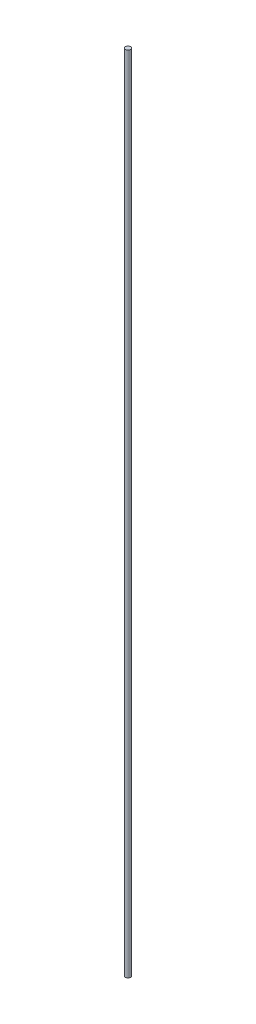
ISO-10303-21;
HEADER;
FILE_DESCRIPTION(('STEP AP214'),'2;1');
FILE_NAME('part.step','',(''),(''),'','','');
FILE_SCHEMA(('AUTOMOTIVE_DESIGN { 1 0 10303 214 1 1 1 1 }'));
ENDSEC;
DATA;
#1=APPLICATION_CONTEXT('core data for automotive mechanical design processes');
#2=APPLICATION_PROTOCOL_DEFINITION('international standard','automotive_design',2000,#1);
#3=PRODUCT_CONTEXT('',#1,'mechanical');
#4=PRODUCT('Part','Part','',(#3));
#5=PRODUCT_RELATED_PRODUCT_CATEGORY('part','',(#4));
#6=PRODUCT_DEFINITION_FORMATION('','',#4);
#7=PRODUCT_DEFINITION_CONTEXT('part definition',#1,'design');
#8=PRODUCT_DEFINITION('design','',#6,#7);
#9=PRODUCT_DEFINITION_SHAPE('','',#8);
#10=(LENGTH_UNIT() NAMED_UNIT(*) SI_UNIT(.MILLI.,.METRE.));
#11=(NAMED_UNIT(*) PLANE_ANGLE_UNIT() SI_UNIT($,.RADIAN.));
#12=(NAMED_UNIT(*) SI_UNIT($,.STERADIAN.) SOLID_ANGLE_UNIT());
#13=UNCERTAINTY_MEASURE_WITH_UNIT(LENGTH_MEASURE(1.E-05),#10,'distance_accuracy_value','');
#14=(GEOMETRIC_REPRESENTATION_CONTEXT(3) GLOBAL_UNCERTAINTY_ASSIGNED_CONTEXT((#13)) GLOBAL_UNIT_ASSIGNED_CONTEXT((#10,
#11,#12)) REPRESENTATION_CONTEXT('',''));
#15=CARTESIAN_POINT('',(0.,0.,0.));
#16=DIRECTION('',(0.,0.,1.));
#17=DIRECTION('',(1.,0.,0.));
#18=AXIS2_PLACEMENT_3D('',#15,#16,#17);
#19=CARTESIAN_POINT('',(0.,0.,0.));
#20=DIRECTION('',(0.,1.,0.));
#21=DIRECTION('',(0.,0.,1.));
#22=AXIS2_PLACEMENT_3D('',#19,#20,#21);
#23=PLANE('',#22);
#24=CARTESIAN_POINT('',(0.,0.,0.));
#25=DIRECTION('',(0.,1.,0.));
#26=DIRECTION('',(0.,0.,1.));
#27=AXIS2_PLACEMENT_3D('',#24,#25,#26);
#28=CIRCLE('',#27,6.35);
#29=CARTESIAN_POINT('',(0.,0.,6.35));
#30=VERTEX_POINT('',#29);
#31=EDGE_CURVE('E48',#30,#30,#28,.T.);
#32=ORIENTED_EDGE('',*,*,#31,.F.);
#33=EDGE_LOOP('',(#32));
#34=FACE_BOUND('',#33,.T.);
#35=ADVANCED_FACE('F42',(#34),#23,.F.);
#36=CARTESIAN_POINT('',(0.,1993.646,0.));
#37=DIRECTION('',(0.,1.,0.));
#38=DIRECTION('',(0.,0.,1.));
#39=AXIS2_PLACEMENT_3D('',#36,#37,#38);
#40=PLANE('',#39);
#41=CARTESIAN_POINT('',(0.,1993.646,0.));
#42=DIRECTION('',(0.,1.,0.));
#43=DIRECTION('',(0.,0.,1.));
#44=AXIS2_PLACEMENT_3D('',#41,#42,#43);
#45=CIRCLE('',#44,6.35);
#46=CARTESIAN_POINT('',(0.,1993.646,6.35));
#47=VERTEX_POINT('',#46);
#48=EDGE_CURVE('E11',#47,#47,#45,.T.);
#49=ORIENTED_EDGE('',*,*,#48,.T.);
#50=EDGE_LOOP('',(#49));
#51=FACE_BOUND('',#50,.T.);
#52=ADVANCED_FACE('F57',(#51),#40,.T.);
#53=CARTESIAN_POINT('',(0.,0.,0.));
#54=DIRECTION('',(0.,1.,0.));
#55=DIRECTION('',(0.,0.,1.));
#56=AXIS2_PLACEMENT_3D('',#53,#54,#55);
#57=CYLINDRICAL_SURFACE('',#56,6.35);
#58=ORIENTED_EDGE('',*,*,#48,.F.);
#59=EDGE_LOOP('',(#58));
#60=FACE_BOUND('',#59,.T.);
#61=ORIENTED_EDGE('',*,*,#31,.T.);
#62=EDGE_LOOP('',(#61));
#63=FACE_BOUND('',#62,.T.);
#64=ADVANCED_FACE('F54',(#60,#63),#57,.T.);
#65=CLOSED_SHELL('',(#35,#52,#64));
#66=MANIFOLD_SOLID_BREP('B2',#65);
#67=ADVANCED_BREP_SHAPE_REPRESENTATION('',(#18,#66),#14);
#68=SHAPE_DEFINITION_REPRESENTATION(#9,#67);
ENDSEC;
END-ISO-10303-21;
